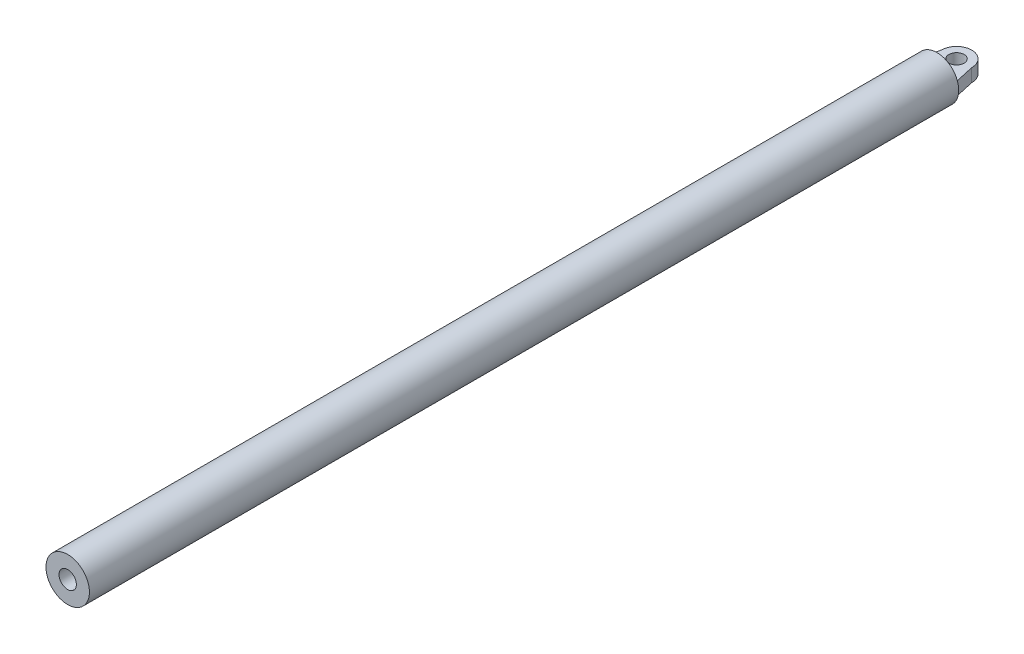
ISO-10303-21;
HEADER;
FILE_DESCRIPTION(('STEP AP214'),'2;1');
FILE_NAME('part.step','',(''),(''),'','','');
FILE_SCHEMA(('AUTOMOTIVE_DESIGN { 1 0 10303 214 1 1 1 1 }'));
ENDSEC;
DATA;
#1=APPLICATION_CONTEXT('core data for automotive mechanical design processes');
#2=APPLICATION_PROTOCOL_DEFINITION('international standard','automotive_design',2000,#1);
#3=PRODUCT_CONTEXT('',#1,'mechanical');
#4=PRODUCT('Part','Part','',(#3));
#5=PRODUCT_RELATED_PRODUCT_CATEGORY('part','',(#4));
#6=PRODUCT_DEFINITION_FORMATION('','',#4);
#7=PRODUCT_DEFINITION_CONTEXT('part definition',#1,'design');
#8=PRODUCT_DEFINITION('design','',#6,#7);
#9=PRODUCT_DEFINITION_SHAPE('','',#8);
#10=(LENGTH_UNIT() NAMED_UNIT(*) SI_UNIT(.MILLI.,.METRE.));
#11=(NAMED_UNIT(*) PLANE_ANGLE_UNIT() SI_UNIT($,.RADIAN.));
#12=(NAMED_UNIT(*) SI_UNIT($,.STERADIAN.) SOLID_ANGLE_UNIT());
#13=UNCERTAINTY_MEASURE_WITH_UNIT(LENGTH_MEASURE(1.E-05),#10,'distance_accuracy_value','');
#14=(GEOMETRIC_REPRESENTATION_CONTEXT(3) GLOBAL_UNCERTAINTY_ASSIGNED_CONTEXT((#13)) GLOBAL_UNIT_ASSIGNED_CONTEXT((#10,
#11,#12)) REPRESENTATION_CONTEXT('',''));
#15=CARTESIAN_POINT('',(0.,0.,0.));
#16=DIRECTION('',(0.,0.,1.));
#17=DIRECTION('',(1.,0.,0.));
#18=AXIS2_PLACEMENT_3D('',#15,#16,#17);
#19=CARTESIAN_POINT('',(0.,0.,2000.));
#20=DIRECTION('',(0.,0.,-1.));
#21=DIRECTION('',(-1.,0.,0.));
#22=AXIS2_PLACEMENT_3D('',#19,#20,#21);
#23=CYLINDRICAL_SURFACE('',#22,50.);
#24=CARTESIAN_POINT('',(0.,0.,2000.));
#25=DIRECTION('',(0.,0.,1.));
#26=DIRECTION('',(1.,0.,0.));
#27=AXIS2_PLACEMENT_3D('',#24,#25,#26);
#28=CIRCLE('',#27,50.);
#29=CARTESIAN_POINT('',(50.,0.,2000.));
#30=VERTEX_POINT('',#29);
#31=EDGE_CURVE('E11',#30,#30,#28,.T.);
#32=ORIENTED_EDGE('',*,*,#31,.F.);
#33=EDGE_LOOP('',(#32));
#34=FACE_BOUND('',#33,.T.);
#35=CARTESIAN_POINT('',(0.,0.,0.));
#36=DIRECTION('',(0.,0.,1.));
#37=DIRECTION('',(1.,0.,0.));
#38=AXIS2_PLACEMENT_3D('',#35,#36,#37);
#39=CIRCLE('',#38,50.);
#40=CARTESIAN_POINT('',(50.,0.,0.));
#41=VERTEX_POINT('',#40);
#42=EDGE_CURVE('E39',#41,#41,#39,.T.);
#43=ORIENTED_EDGE('',*,*,#42,.T.);
#44=EDGE_LOOP('',(#43));
#45=FACE_BOUND('',#44,.T.);
#46=ADVANCED_FACE('F36',(#34,#45),#23,.T.);
#47=CARTESIAN_POINT('',(0.,0.,2000.));
#48=DIRECTION('',(0.,0.,1.));
#49=DIRECTION('',(1.,0.,0.));
#50=AXIS2_PLACEMENT_3D('',#47,#48,#49);
#51=PLANE('',#50);
#52=CARTESIAN_POINT('',(0.,0.,2000.));
#53=DIRECTION('',(0.,0.,1.));
#54=DIRECTION('',(1.,0.,0.));
#55=AXIS2_PLACEMENT_3D('',#52,#53,#54);
#56=CIRCLE('',#55,20.);
#57=CARTESIAN_POINT('',(20.,0.,2000.));
#58=VERTEX_POINT('',#57);
#59=EDGE_CURVE('E108',#58,#58,#56,.T.);
#60=ORIENTED_EDGE('',*,*,#59,.F.);
#61=EDGE_LOOP('',(#60));
#62=FACE_BOUND('',#61,.T.);
#63=ORIENTED_EDGE('',*,*,#31,.T.);
#64=EDGE_LOOP('',(#63));
#65=FACE_BOUND('',#64,.T.);
#66=ADVANCED_FACE('F139',(#62,#65),#51,.T.);
#67=CARTESIAN_POINT('',(0.,0.,0.));
#68=DIRECTION('',(0.,0.,1.));
#69=DIRECTION('',(1.,0.,0.));
#70=AXIS2_PLACEMENT_3D('',#67,#68,#69);
#71=PLANE('',#70);
#72=DIRECTION('',(0.,-1.,0.));
#73=VECTOR('',#72,1.);
#74=CARTESIAN_POINT('',(45.,15.,0.));
#75=LINE('',#74,#73);
#76=CARTESIAN_POINT('',(45.,15.,0.));
#77=VERTEX_POINT('',#76);
#78=CARTESIAN_POINT('',(45.,-15.,0.));
#79=VERTEX_POINT('',#78);
#80=EDGE_CURVE('E55',#77,#79,#75,.T.);
#81=ORIENTED_EDGE('',*,*,#80,.F.);
#82=DIRECTION('',(1.,0.,0.));
#83=VECTOR('',#82,1.);
#84=CARTESIAN_POINT('',(0.,15.,0.));
#85=LINE('',#84,#83);
#86=CARTESIAN_POINT('',(-45.,15.,0.));
#87=VERTEX_POINT('',#86);
#88=EDGE_CURVE('E50',#87,#77,#85,.T.);
#89=ORIENTED_EDGE('',*,*,#88,.F.);
#90=DIRECTION('',(0.,-1.,0.));
#91=VECTOR('',#90,1.);
#92=CARTESIAN_POINT('',(-45.,15.,0.));
#93=LINE('',#92,#91);
#94=CARTESIAN_POINT('',(-45.,-15.,0.));
#95=VERTEX_POINT('',#94);
#96=EDGE_CURVE('E85',#87,#95,#93,.T.);
#97=ORIENTED_EDGE('',*,*,#96,.T.);
#98=DIRECTION('',(1.,0.,0.));
#99=VECTOR('',#98,1.);
#100=CARTESIAN_POINT('',(0.,-15.,0.));
#101=LINE('',#100,#99);
#102=EDGE_CURVE('E110',#95,#79,#101,.T.);
#103=ORIENTED_EDGE('',*,*,#102,.T.);
#104=EDGE_LOOP('',(#81,#89,#97,#103));
#105=FACE_BOUND('',#104,.T.);
#106=ORIENTED_EDGE('',*,*,#42,.F.);
#107=EDGE_LOOP('',(#106));
#108=FACE_BOUND('',#107,.T.);
#109=ADVANCED_FACE('F120',(#105,#108),#71,.F.);
#110=CARTESIAN_POINT('',(0.,15.,-45.));
#111=DIRECTION('',(0.,-1.,0.));
#112=DIRECTION('',(0.,0.,-1.));
#113=AXIS2_PLACEMENT_3D('',#110,#111,#112);
#114=CYLINDRICAL_SURFACE('',#113,35.);
#115=CARTESIAN_POINT('',(0.,-15.,-45.));
#116=DIRECTION('',(0.,1.,0.));
#117=DIRECTION('',(0.,0.,1.));
#118=AXIS2_PLACEMENT_3D('',#115,#116,#117);
#119=CIRCLE('',#118,35.);
#120=CARTESIAN_POINT('',(-35.,-15.,-45.));
#121=VERTEX_POINT('',#120);
#122=CARTESIAN_POINT('',(35.,-15.,-45.));
#123=VERTEX_POINT('',#122);
#124=EDGE_CURVE('E80',#121,#123,#119,.F.);
#125=ORIENTED_EDGE('',*,*,#124,.F.);
#126=DIRECTION('',(0.,-1.,0.));
#127=VECTOR('',#126,1.);
#128=CARTESIAN_POINT('',(-35.,15.,-45.));
#129=LINE('',#128,#127);
#130=CARTESIAN_POINT('',(-35.,15.,-45.));
#131=VERTEX_POINT('',#130);
#132=EDGE_CURVE('E74',#131,#121,#129,.T.);
#133=ORIENTED_EDGE('',*,*,#132,.F.);
#134=CARTESIAN_POINT('',(0.,15.,-45.));
#135=DIRECTION('',(0.,1.,0.));
#136=DIRECTION('',(0.,0.,1.));
#137=AXIS2_PLACEMENT_3D('',#134,#135,#136);
#138=CIRCLE('',#137,35.);
#139=CARTESIAN_POINT('',(35.,15.,-45.));
#140=VERTEX_POINT('',#139);
#141=EDGE_CURVE('E77',#131,#140,#138,.F.);
#142=ORIENTED_EDGE('',*,*,#141,.T.);
#143=DIRECTION('',(0.,-1.,0.));
#144=VECTOR('',#143,1.);
#145=CARTESIAN_POINT('',(35.,15.,-45.));
#146=LINE('',#145,#144);
#147=EDGE_CURVE('E105',#140,#123,#146,.T.);
#148=ORIENTED_EDGE('',*,*,#147,.T.);
#149=EDGE_LOOP('',(#125,#133,#142,#148));
#150=FACE_BOUND('',#149,.T.);
#151=ADVANCED_FACE('F76',(#150),#114,.T.);
#152=CARTESIAN_POINT('',(-42.8823529411765,15.,-9.52941176470588));
#153=DIRECTION('',(-0.976187060183953,0.,-0.216930457818656));
#154=DIRECTION('',(-0.216930457818656,0.,0.976187060183953));
#155=AXIS2_PLACEMENT_3D('',#152,#153,#154);
#156=PLANE('',#155);
#157=DIRECTION('',(0.216930457818656,0.,-0.976187060183953));
#158=VECTOR('',#157,1.);
#159=CARTESIAN_POINT('',(-42.8823529411765,-15.,-9.52941176470588));
#160=LINE('',#159,#158);
#161=EDGE_CURVE('E107',#95,#121,#160,.T.);
#162=ORIENTED_EDGE('',*,*,#161,.F.);
#163=ORIENTED_EDGE('',*,*,#96,.F.);
#164=DIRECTION('',(0.216930457818656,0.,-0.976187060183953));
#165=VECTOR('',#164,1.);
#166=CARTESIAN_POINT('',(-42.8823529411765,15.,-9.52941176470588));
#167=LINE('',#166,#165);
#168=EDGE_CURVE('E91',#87,#131,#167,.T.);
#169=ORIENTED_EDGE('',*,*,#168,.T.);
#170=ORIENTED_EDGE('',*,*,#132,.T.);
#171=EDGE_LOOP('',(#162,#163,#169,#170));
#172=FACE_BOUND('',#171,.T.);
#173=ADVANCED_FACE('F96',(#172),#156,.T.);
#174=CARTESIAN_POINT('',(42.8823529411765,15.,-9.52941176470588));
#175=DIRECTION('',(0.976187060183953,0.,-0.216930457818656));
#176=DIRECTION('',(-0.216930457818656,0.,-0.976187060183953));
#177=AXIS2_PLACEMENT_3D('',#174,#175,#176);
#178=PLANE('',#177);
#179=DIRECTION('',(0.216930457818656,0.,0.976187060183953));
#180=VECTOR('',#179,1.);
#181=CARTESIAN_POINT('',(42.8823529411765,-15.,-9.52941176470588));
#182=LINE('',#181,#180);
#183=EDGE_CURVE('E112',#123,#79,#182,.T.);
#184=ORIENTED_EDGE('',*,*,#183,.F.);
#185=ORIENTED_EDGE('',*,*,#147,.F.);
#186=DIRECTION('',(0.216930457818656,0.,0.976187060183953));
#187=VECTOR('',#186,1.);
#188=CARTESIAN_POINT('',(42.8823529411765,15.,-9.52941176470588));
#189=LINE('',#188,#187);
#190=EDGE_CURVE('E93',#140,#77,#189,.T.);
#191=ORIENTED_EDGE('',*,*,#190,.T.);
#192=ORIENTED_EDGE('',*,*,#80,.T.);
#193=EDGE_LOOP('',(#184,#185,#191,#192));
#194=FACE_BOUND('',#193,.T.);
#195=ADVANCED_FACE('F127',(#194),#178,.T.);
#196=CARTESIAN_POINT('',(0.,15.,-45.));
#197=DIRECTION('',(0.,-1.,0.));
#198=DIRECTION('',(0.,0.,-1.));
#199=AXIS2_PLACEMENT_3D('',#196,#197,#198);
#200=CYLINDRICAL_SURFACE('',#199,17.5);
#201=CARTESIAN_POINT('',(0.,15.,-45.));
#202=DIRECTION('',(0.,1.,0.));
#203=DIRECTION('',(0.,0.,1.));
#204=AXIS2_PLACEMENT_3D('',#201,#202,#203);
#205=CIRCLE('',#204,17.5);
#206=CARTESIAN_POINT('',(0.,15.,-27.5));
#207=VERTEX_POINT('',#206);
#208=EDGE_CURVE('E102',#207,#207,#205,.T.);
#209=ORIENTED_EDGE('',*,*,#208,.T.);
#210=EDGE_LOOP('',(#209));
#211=FACE_BOUND('',#210,.T.);
#212=CARTESIAN_POINT('',(0.,-15.,-45.));
#213=DIRECTION('',(0.,1.,0.));
#214=DIRECTION('',(0.,0.,1.));
#215=AXIS2_PLACEMENT_3D('',#212,#213,#214);
#216=CIRCLE('',#215,17.5);
#217=CARTESIAN_POINT('',(0.,-15.,-27.5));
#218=VERTEX_POINT('',#217);
#219=EDGE_CURVE('E94',#218,#218,#216,.T.);
#220=ORIENTED_EDGE('',*,*,#219,.F.);
#221=EDGE_LOOP('',(#220));
#222=FACE_BOUND('',#221,.T.);
#223=ADVANCED_FACE('F129',(#211,#222),#200,.F.);
#224=CARTESIAN_POINT('',(0.,15.,0.));
#225=DIRECTION('',(0.,1.,0.));
#226=DIRECTION('',(0.,0.,1.));
#227=AXIS2_PLACEMENT_3D('',#224,#225,#226);
#228=PLANE('',#227);
#229=ORIENTED_EDGE('',*,*,#141,.F.);
#230=ORIENTED_EDGE('',*,*,#168,.F.);
#231=ORIENTED_EDGE('',*,*,#88,.T.);
#232=ORIENTED_EDGE('',*,*,#190,.F.);
#233=EDGE_LOOP('',(#229,#230,#231,#232));
#234=FACE_BOUND('',#233,.T.);
#235=ORIENTED_EDGE('',*,*,#208,.F.);
#236=EDGE_LOOP('',(#235));
#237=FACE_BOUND('',#236,.T.);
#238=ADVANCED_FACE('F89',(#234,#237),#228,.T.);
#239=CARTESIAN_POINT('',(0.,-15.,0.));
#240=DIRECTION('',(0.,1.,0.));
#241=DIRECTION('',(0.,0.,1.));
#242=AXIS2_PLACEMENT_3D('',#239,#240,#241);
#243=PLANE('',#242);
#244=ORIENTED_EDGE('',*,*,#124,.T.);
#245=ORIENTED_EDGE('',*,*,#183,.T.);
#246=ORIENTED_EDGE('',*,*,#102,.F.);
#247=ORIENTED_EDGE('',*,*,#161,.T.);
#248=EDGE_LOOP('',(#244,#245,#246,#247));
#249=FACE_BOUND('',#248,.T.);
#250=ORIENTED_EDGE('',*,*,#219,.T.);
#251=EDGE_LOOP('',(#250));
#252=FACE_BOUND('',#251,.T.);
#253=ADVANCED_FACE('F123',(#249,#252),#243,.F.);
#254=CARTESIAN_POINT('',(0.,0.,2000.));
#255=DIRECTION('',(0.,0.,-1.));
#256=DIRECTION('',(-1.,0.,0.));
#257=AXIS2_PLACEMENT_3D('',#254,#255,#256);
#258=CYLINDRICAL_SURFACE('',#257,20.);
#259=ORIENTED_EDGE('',*,*,#59,.T.);
#260=EDGE_LOOP('',(#259));
#261=FACE_BOUND('',#260,.T.);
#262=CARTESIAN_POINT('',(0.,0.,30.));
#263=DIRECTION('',(0.,0.,1.));
#264=DIRECTION('',(1.,0.,0.));
#265=AXIS2_PLACEMENT_3D('',#262,#263,#264);
#266=CIRCLE('',#265,20.);
#267=CARTESIAN_POINT('',(20.,0.,30.));
#268=VERTEX_POINT('',#267);
#269=EDGE_CURVE('E256',#268,#268,#266,.T.);
#270=ORIENTED_EDGE('',*,*,#269,.F.);
#271=EDGE_LOOP('',(#270));
#272=FACE_BOUND('',#271,.T.);
#273=ADVANCED_FACE('F194',(#261,#272),#258,.F.);
#274=CARTESIAN_POINT('',(0.,0.,30.));
#275=DIRECTION('',(0.,0.,1.));
#276=DIRECTION('',(1.,0.,0.));
#277=AXIS2_PLACEMENT_3D('',#274,#275,#276);
#278=PLANE('',#277);
#279=ORIENTED_EDGE('',*,*,#269,.T.);
#280=EDGE_LOOP('',(#279));
#281=FACE_BOUND('',#280,.T.);
#282=ADVANCED_FACE('F199',(#281),#278,.T.);
#283=CLOSED_SHELL('',(#46,#66,#109,#151,#173,#195,#223,#238,#253,#273,#282));
#284=MANIFOLD_SOLID_BREP('B2',#283);
#285=ADVANCED_BREP_SHAPE_REPRESENTATION('',(#18,#284),#14);
#286=SHAPE_DEFINITION_REPRESENTATION(#9,#285);
ENDSEC;
END-ISO-10303-21;
